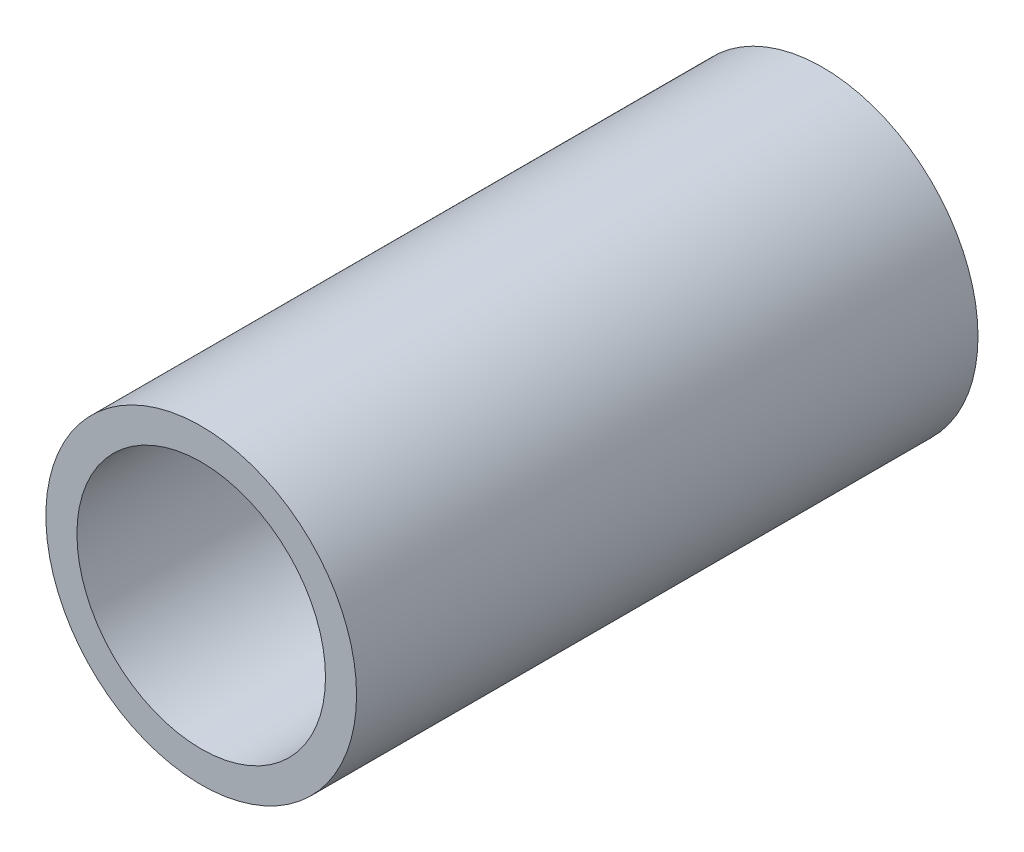
ISO-10303-21;
HEADER;
FILE_DESCRIPTION(('STEP AP214'),'2;1');
FILE_NAME('part.step','',(''),(''),'','','');
FILE_SCHEMA(('AUTOMOTIVE_DESIGN { 1 0 10303 214 1 1 1 1 }'));
ENDSEC;
DATA;
#1=APPLICATION_CONTEXT('core data for automotive mechanical design processes');
#2=APPLICATION_PROTOCOL_DEFINITION('international standard','automotive_design',2000,#1);
#3=PRODUCT_CONTEXT('',#1,'mechanical');
#4=PRODUCT('Part','Part','',(#3));
#5=PRODUCT_RELATED_PRODUCT_CATEGORY('part','',(#4));
#6=PRODUCT_DEFINITION_FORMATION('','',#4);
#7=PRODUCT_DEFINITION_CONTEXT('part definition',#1,'design');
#8=PRODUCT_DEFINITION('design','',#6,#7);
#9=PRODUCT_DEFINITION_SHAPE('','',#8);
#10=(LENGTH_UNIT() NAMED_UNIT(*) SI_UNIT(.MILLI.,.METRE.));
#11=(NAMED_UNIT(*) PLANE_ANGLE_UNIT() SI_UNIT($,.RADIAN.));
#12=(NAMED_UNIT(*) SI_UNIT($,.STERADIAN.) SOLID_ANGLE_UNIT());
#13=UNCERTAINTY_MEASURE_WITH_UNIT(LENGTH_MEASURE(1.E-05),#10,'distance_accuracy_value','');
#14=(GEOMETRIC_REPRESENTATION_CONTEXT(3) GLOBAL_UNCERTAINTY_ASSIGNED_CONTEXT((#13)) GLOBAL_UNIT_ASSIGNED_CONTEXT((#10,
#11,#12)) REPRESENTATION_CONTEXT('',''));
#15=CARTESIAN_POINT('',(0.,0.,0.));
#16=DIRECTION('',(0.,0.,1.));
#17=DIRECTION('',(1.,0.,0.));
#18=AXIS2_PLACEMENT_3D('',#15,#16,#17);
#19=CARTESIAN_POINT('',(0.,0.,20.));
#20=DIRECTION('',(0.,0.,-1.));
#21=DIRECTION('',(-1.,0.,0.));
#22=AXIS2_PLACEMENT_3D('',#19,#20,#21);
#23=CYLINDRICAL_SURFACE('',#22,5.);
#24=CARTESIAN_POINT('',(0.,0.,20.));
#25=DIRECTION('',(0.,0.,1.));
#26=DIRECTION('',(1.,0.,0.));
#27=AXIS2_PLACEMENT_3D('',#24,#25,#26);
#28=CIRCLE('',#27,5.);
#29=CARTESIAN_POINT('',(5.,0.,20.));
#30=VERTEX_POINT('',#29);
#31=EDGE_CURVE('E10',#30,#30,#28,.T.);
#32=ORIENTED_EDGE('',*,*,#31,.F.);
#33=EDGE_LOOP('',(#32));
#34=FACE_BOUND('',#33,.T.);
#35=CARTESIAN_POINT('',(0.,0.,0.));
#36=DIRECTION('',(0.,0.,1.));
#37=DIRECTION('',(1.,0.,0.));
#38=AXIS2_PLACEMENT_3D('',#35,#36,#37);
#39=CIRCLE('',#38,5.);
#40=CARTESIAN_POINT('',(5.,0.,0.));
#41=VERTEX_POINT('',#40);
#42=EDGE_CURVE('E37',#41,#41,#39,.T.);
#43=ORIENTED_EDGE('',*,*,#42,.T.);
#44=EDGE_LOOP('',(#43));
#45=FACE_BOUND('',#44,.T.);
#46=ADVANCED_FACE('F34',(#34,#45),#23,.T.);
#47=CARTESIAN_POINT('',(0.,0.,20.));
#48=DIRECTION('',(0.,0.,1.));
#49=DIRECTION('',(1.,0.,0.));
#50=AXIS2_PLACEMENT_3D('',#47,#48,#49);
#51=PLANE('',#50);
#52=CARTESIAN_POINT('',(0.,0.,20.));
#53=DIRECTION('',(0.,0.,1.));
#54=DIRECTION('',(1.,0.,0.));
#55=AXIS2_PLACEMENT_3D('',#52,#53,#54);
#56=CIRCLE('',#55,4.);
#57=CARTESIAN_POINT('',(4.,0.,20.));
#58=VERTEX_POINT('',#57);
#59=EDGE_CURVE('E46',#58,#58,#56,.T.);
#60=ORIENTED_EDGE('',*,*,#59,.F.);
#61=EDGE_LOOP('',(#60));
#62=FACE_BOUND('',#61,.T.);
#63=ORIENTED_EDGE('',*,*,#31,.T.);
#64=EDGE_LOOP('',(#63));
#65=FACE_BOUND('',#64,.T.);
#66=ADVANCED_FACE('F61',(#62,#65),#51,.T.);
#67=CARTESIAN_POINT('',(0.,0.,0.));
#68=DIRECTION('',(0.,0.,1.));
#69=DIRECTION('',(1.,0.,0.));
#70=AXIS2_PLACEMENT_3D('',#67,#68,#69);
#71=PLANE('',#70);
#72=ORIENTED_EDGE('',*,*,#42,.F.);
#73=EDGE_LOOP('',(#72));
#74=FACE_BOUND('',#73,.T.);
#75=ADVANCED_FACE('F57',(#74),#71,.F.);
#76=CARTESIAN_POINT('',(0.,0.,2.));
#77=DIRECTION('',(0.,0.,1.));
#78=DIRECTION('',(1.,0.,0.));
#79=AXIS2_PLACEMENT_3D('',#76,#77,#78);
#80=CYLINDRICAL_SURFACE('',#79,4.);
#81=CARTESIAN_POINT('',(0.,0.,2.));
#82=DIRECTION('',(0.,0.,1.));
#83=DIRECTION('',(1.,0.,0.));
#84=AXIS2_PLACEMENT_3D('',#81,#82,#83);
#85=CIRCLE('',#84,4.);
#86=CARTESIAN_POINT('',(4.,0.,2.));
#87=VERTEX_POINT('',#86);
#88=EDGE_CURVE('E44',#87,#87,#85,.T.);
#89=ORIENTED_EDGE('',*,*,#88,.F.);
#90=EDGE_LOOP('',(#89));
#91=FACE_BOUND('',#90,.T.);
#92=ORIENTED_EDGE('',*,*,#59,.T.);
#93=EDGE_LOOP('',(#92));
#94=FACE_BOUND('',#93,.T.);
#95=ADVANCED_FACE('F54',(#91,#94),#80,.F.);
#96=CARTESIAN_POINT('',(0.,0.,2.));
#97=DIRECTION('',(0.,0.,1.));
#98=DIRECTION('',(1.,0.,0.));
#99=AXIS2_PLACEMENT_3D('',#96,#97,#98);
#100=PLANE('',#99);
#101=ORIENTED_EDGE('',*,*,#88,.T.);
#102=EDGE_LOOP('',(#101));
#103=FACE_BOUND('',#102,.T.);
#104=ADVANCED_FACE('F52',(#103),#100,.T.);
#105=CLOSED_SHELL('',(#46,#66,#75,#95,#104));
#106=MANIFOLD_SOLID_BREP('B2',#105);
#107=ADVANCED_BREP_SHAPE_REPRESENTATION('',(#18,#106),#14);
#108=SHAPE_DEFINITION_REPRESENTATION(#9,#107);
ENDSEC;
END-ISO-10303-21;
